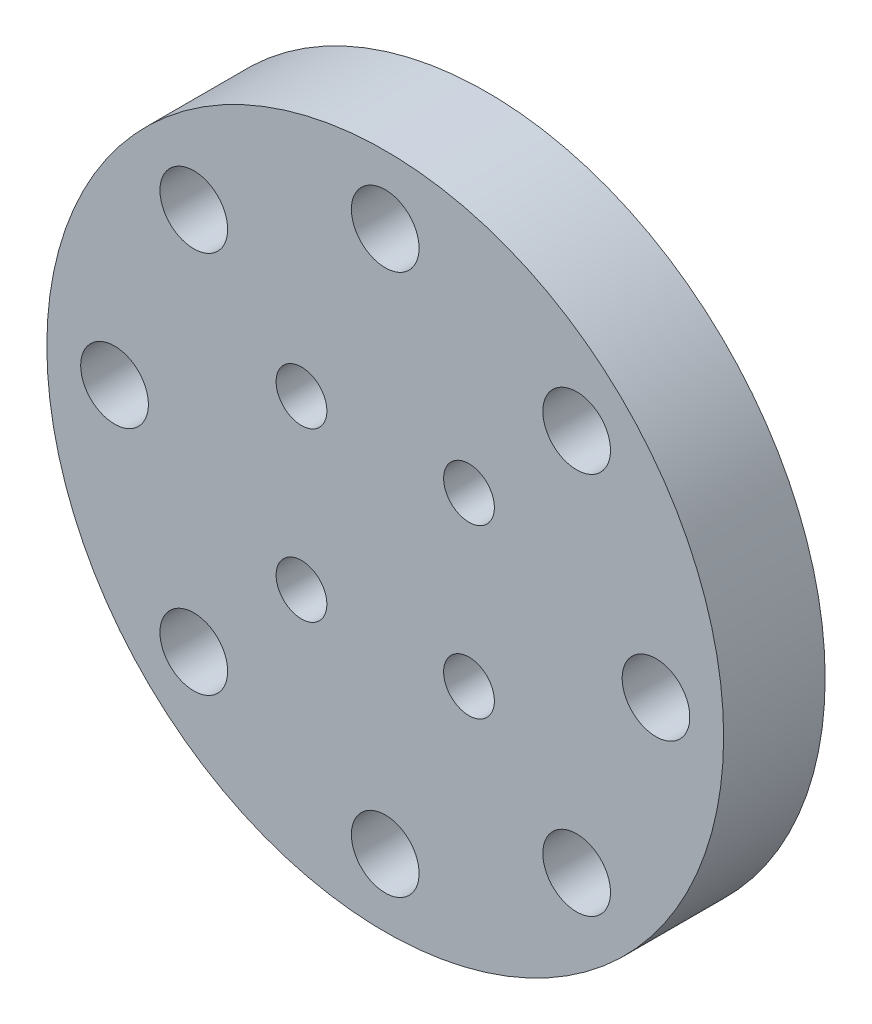
ISO-10303-21;
HEADER;
FILE_DESCRIPTION(('STEP AP214'),'2;1');
FILE_NAME('part.step','',(''),(''),'','','');
FILE_SCHEMA(('AUTOMOTIVE_DESIGN { 1 0 10303 214 1 1 1 1 }'));
ENDSEC;
DATA;
#1=APPLICATION_CONTEXT('core data for automotive mechanical design processes');
#2=APPLICATION_PROTOCOL_DEFINITION('international standard','automotive_design',2000,#1);
#3=PRODUCT_CONTEXT('',#1,'mechanical');
#4=PRODUCT('Part','Part','',(#3));
#5=PRODUCT_RELATED_PRODUCT_CATEGORY('part','',(#4));
#6=PRODUCT_DEFINITION_FORMATION('','',#4);
#7=PRODUCT_DEFINITION_CONTEXT('part definition',#1,'design');
#8=PRODUCT_DEFINITION('design','',#6,#7);
#9=PRODUCT_DEFINITION_SHAPE('','',#8);
#10=(LENGTH_UNIT() NAMED_UNIT(*) SI_UNIT(.MILLI.,.METRE.));
#11=(NAMED_UNIT(*) PLANE_ANGLE_UNIT() SI_UNIT($,.RADIAN.));
#12=(NAMED_UNIT(*) SI_UNIT($,.STERADIAN.) SOLID_ANGLE_UNIT());
#13=UNCERTAINTY_MEASURE_WITH_UNIT(LENGTH_MEASURE(1.E-05),#10,'distance_accuracy_value','');
#14=(GEOMETRIC_REPRESENTATION_CONTEXT(3) GLOBAL_UNCERTAINTY_ASSIGNED_CONTEXT((#13)) GLOBAL_UNIT_ASSIGNED_CONTEXT((#10,
#11,#12)) REPRESENTATION_CONTEXT('',''));
#15=CARTESIAN_POINT('',(0.,0.,0.));
#16=DIRECTION('',(0.,0.,1.));
#17=DIRECTION('',(1.,0.,0.));
#18=AXIS2_PLACEMENT_3D('',#15,#16,#17);
#19=CARTESIAN_POINT('',(4.94974746830581,-4.94974746830586,6.));
#20=DIRECTION('',(0.,0.,-1.));
#21=DIRECTION('',(-1.,0.,0.));
#22=AXIS2_PLACEMENT_3D('',#19,#20,#21);
#23=CYLINDRICAL_SURFACE('',#22,1.5);
#24=CARTESIAN_POINT('',(4.94974746830581,-4.94974746830586,6.));
#25=DIRECTION('',(0.,0.,-1.));
#26=DIRECTION('',(-1.,0.,0.));
#27=AXIS2_PLACEMENT_3D('',#24,#25,#26);
#28=CIRCLE('',#27,1.5);
#29=CARTESIAN_POINT('',(3.44974746830581,-4.94974746830586,6.));
#30=VERTEX_POINT('',#29);
#31=EDGE_CURVE('E114',#30,#30,#28,.T.);
#32=ORIENTED_EDGE('',*,*,#31,.F.);
#33=EDGE_LOOP('',(#32));
#34=FACE_BOUND('',#33,.T.);
#35=CARTESIAN_POINT('',(4.94974746830581,-4.94974746830586,3.1));
#36=DIRECTION('',(0.,0.,-1.));
#37=DIRECTION('',(-1.,0.,0.));
#38=AXIS2_PLACEMENT_3D('',#35,#36,#37);
#39=CIRCLE('',#38,1.5);
#40=CARTESIAN_POINT('',(3.44974746830581,-4.94974746830586,3.1));
#41=VERTEX_POINT('',#40);
#42=EDGE_CURVE('E39',#41,#41,#39,.F.);
#43=ORIENTED_EDGE('',*,*,#42,.F.);
#44=EDGE_LOOP('',(#43));
#45=FACE_BOUND('',#44,.T.);
#46=ADVANCED_FACE('F35',(#34,#45),#23,.F.);
#47=CARTESIAN_POINT('',(4.94974746830586,4.94974746830581,6.));
#48=DIRECTION('',(0.,0.,-1.));
#49=DIRECTION('',(-1.,0.,0.));
#50=AXIS2_PLACEMENT_3D('',#47,#48,#49);
#51=CYLINDRICAL_SURFACE('',#50,1.5);
#52=CARTESIAN_POINT('',(4.94974746830586,4.94974746830581,6.));
#53=DIRECTION('',(0.,0.,-1.));
#54=DIRECTION('',(-1.,0.,0.));
#55=AXIS2_PLACEMENT_3D('',#52,#53,#54);
#56=CIRCLE('',#55,1.5);
#57=CARTESIAN_POINT('',(3.44974746830586,4.94974746830581,6.));
#58=VERTEX_POINT('',#57);
#59=EDGE_CURVE('E74',#58,#58,#56,.T.);
#60=ORIENTED_EDGE('',*,*,#59,.F.);
#61=EDGE_LOOP('',(#60));
#62=FACE_BOUND('',#61,.T.);
#63=CARTESIAN_POINT('',(4.94974746830586,4.94974746830581,3.1));
#64=DIRECTION('',(0.,0.,-1.));
#65=DIRECTION('',(-1.,0.,0.));
#66=AXIS2_PLACEMENT_3D('',#63,#64,#65);
#67=CIRCLE('',#66,1.5);
#68=CARTESIAN_POINT('',(3.44974746830586,4.94974746830581,3.1));
#69=VERTEX_POINT('',#68);
#70=EDGE_CURVE('E60',#69,#69,#67,.F.);
#71=ORIENTED_EDGE('',*,*,#70,.F.);
#72=EDGE_LOOP('',(#71));
#73=FACE_BOUND('',#72,.T.);
#74=ADVANCED_FACE('F145',(#62,#73),#51,.F.);
#75=CARTESIAN_POINT('',(-4.94974746830581,4.94974746830586,6.));
#76=DIRECTION('',(0.,0.,-1.));
#77=DIRECTION('',(-1.,0.,0.));
#78=AXIS2_PLACEMENT_3D('',#75,#76,#77);
#79=CYLINDRICAL_SURFACE('',#78,1.5);
#80=CARTESIAN_POINT('',(-4.94974746830581,4.94974746830586,6.));
#81=DIRECTION('',(0.,0.,-1.));
#82=DIRECTION('',(-1.,0.,0.));
#83=AXIS2_PLACEMENT_3D('',#80,#81,#82);
#84=CIRCLE('',#83,1.5);
#85=CARTESIAN_POINT('',(-6.44974746830581,4.94974746830586,6.));
#86=VERTEX_POINT('',#85);
#87=EDGE_CURVE('E69',#86,#86,#84,.T.);
#88=ORIENTED_EDGE('',*,*,#87,.F.);
#89=EDGE_LOOP('',(#88));
#90=FACE_BOUND('',#89,.T.);
#91=CARTESIAN_POINT('',(-4.94974746830581,4.94974746830586,3.1));
#92=DIRECTION('',(0.,0.,-1.));
#93=DIRECTION('',(-1.,0.,0.));
#94=AXIS2_PLACEMENT_3D('',#91,#92,#93);
#95=CIRCLE('',#94,1.5);
#96=CARTESIAN_POINT('',(-6.44974746830581,4.94974746830586,3.1));
#97=VERTEX_POINT('',#96);
#98=EDGE_CURVE('E57',#97,#97,#95,.F.);
#99=ORIENTED_EDGE('',*,*,#98,.F.);
#100=EDGE_LOOP('',(#99));
#101=FACE_BOUND('',#100,.T.);
#102=ADVANCED_FACE('F150',(#90,#101),#79,.F.);
#103=CARTESIAN_POINT('',(-4.94974746830586,-4.94974746830581,6.));
#104=DIRECTION('',(0.,0.,-1.));
#105=DIRECTION('',(-1.,0.,0.));
#106=AXIS2_PLACEMENT_3D('',#103,#104,#105);
#107=CYLINDRICAL_SURFACE('',#106,1.5);
#108=CARTESIAN_POINT('',(-4.94974746830586,-4.94974746830581,6.));
#109=DIRECTION('',(0.,0.,-1.));
#110=DIRECTION('',(-1.,0.,0.));
#111=AXIS2_PLACEMENT_3D('',#108,#109,#110);
#112=CIRCLE('',#111,1.5);
#113=CARTESIAN_POINT('',(-6.44974746830586,-4.94974746830581,6.));
#114=VERTEX_POINT('',#113);
#115=EDGE_CURVE('E65',#114,#114,#112,.T.);
#116=ORIENTED_EDGE('',*,*,#115,.F.);
#117=EDGE_LOOP('',(#116));
#118=FACE_BOUND('',#117,.T.);
#119=CARTESIAN_POINT('',(-4.94974746830586,-4.94974746830581,3.1));
#120=DIRECTION('',(0.,0.,-1.));
#121=DIRECTION('',(-1.,0.,0.));
#122=AXIS2_PLACEMENT_3D('',#119,#120,#121);
#123=CIRCLE('',#122,1.5);
#124=CARTESIAN_POINT('',(-6.44974746830586,-4.94974746830581,3.1));
#125=VERTEX_POINT('',#124);
#126=EDGE_CURVE('E54',#125,#125,#123,.F.);
#127=ORIENTED_EDGE('',*,*,#126,.F.);
#128=EDGE_LOOP('',(#127));
#129=FACE_BOUND('',#128,.T.);
#130=ADVANCED_FACE('F172',(#118,#129),#107,.F.);
#131=CARTESIAN_POINT('',(0.,0.,6.));
#132=DIRECTION('',(0.,0.,-1.));
#133=DIRECTION('',(-1.,0.,0.));
#134=AXIS2_PLACEMENT_3D('',#131,#132,#133);
#135=CYLINDRICAL_SURFACE('',#134,20.);
#136=CARTESIAN_POINT('',(0.,0.,6.));
#137=DIRECTION('',(0.,0.,1.));
#138=DIRECTION('',(1.,0.,0.));
#139=AXIS2_PLACEMENT_3D('',#136,#137,#138);
#140=CIRCLE('',#139,20.);
#141=CARTESIAN_POINT('',(20.,0.,6.));
#142=VERTEX_POINT('',#141);
#143=EDGE_CURVE('E10',#142,#142,#140,.T.);
#144=ORIENTED_EDGE('',*,*,#143,.F.);
#145=EDGE_LOOP('',(#144));
#146=FACE_BOUND('',#145,.T.);
#147=CARTESIAN_POINT('',(0.,0.,0.));
#148=DIRECTION('',(0.,0.,1.));
#149=DIRECTION('',(1.,0.,0.));
#150=AXIS2_PLACEMENT_3D('',#147,#148,#149);
#151=CIRCLE('',#150,20.);
#152=CARTESIAN_POINT('',(20.,0.,0.));
#153=VERTEX_POINT('',#152);
#154=EDGE_CURVE('E43',#153,#153,#151,.T.);
#155=ORIENTED_EDGE('',*,*,#154,.T.);
#156=EDGE_LOOP('',(#155));
#157=FACE_BOUND('',#156,.T.);
#158=ADVANCED_FACE('F37',(#146,#157),#135,.T.);
#159=CARTESIAN_POINT('',(0.,0.,6.));
#160=DIRECTION('',(0.,0.,1.));
#161=DIRECTION('',(1.,0.,0.));
#162=AXIS2_PLACEMENT_3D('',#159,#160,#161);
#163=PLANE('',#162);
#164=CARTESIAN_POINT('',(0.,16.,6.));
#165=DIRECTION('',(0.,0.,-1.));
#166=DIRECTION('',(-1.,0.,0.));
#167=AXIS2_PLACEMENT_3D('',#164,#165,#166);
#168=CIRCLE('',#167,2.);
#169=CARTESIAN_POINT('',(-2.,16.,6.));
#170=VERTEX_POINT('',#169);
#171=EDGE_CURVE('E48',#170,#170,#168,.T.);
#172=ORIENTED_EDGE('',*,*,#171,.T.);
#173=EDGE_LOOP('',(#172));
#174=FACE_BOUND('',#173,.T.);
#175=ORIENTED_EDGE('',*,*,#115,.T.);
#176=EDGE_LOOP('',(#175));
#177=FACE_BOUND('',#176,.T.);
#178=ORIENTED_EDGE('',*,*,#87,.T.);
#179=EDGE_LOOP('',(#178));
#180=FACE_BOUND('',#179,.T.);
#181=ORIENTED_EDGE('',*,*,#59,.T.);
#182=EDGE_LOOP('',(#181));
#183=FACE_BOUND('',#182,.T.);
#184=CARTESIAN_POINT('',(-11.3137084989847,-11.3137084989848,6.));
#185=DIRECTION('',(0.,0.,-1.));
#186=DIRECTION('',(-1.,0.,0.));
#187=AXIS2_PLACEMENT_3D('',#184,#185,#186);
#188=CIRCLE('',#187,2.);
#189=CARTESIAN_POINT('',(-13.3137084989847,-11.3137084989848,6.));
#190=VERTEX_POINT('',#189);
#191=EDGE_CURVE('E81',#190,#190,#188,.T.);
#192=ORIENTED_EDGE('',*,*,#191,.T.);
#193=EDGE_LOOP('',(#192));
#194=FACE_BOUND('',#193,.T.);
#195=CARTESIAN_POINT('',(-16.,0.,6.));
#196=DIRECTION('',(0.,0.,-1.));
#197=DIRECTION('',(-1.,0.,0.));
#198=AXIS2_PLACEMENT_3D('',#195,#196,#197);
#199=CIRCLE('',#198,2.);
#200=CARTESIAN_POINT('',(-18.,0.,6.));
#201=VERTEX_POINT('',#200);
#202=EDGE_CURVE('E106',#201,#201,#199,.T.);
#203=ORIENTED_EDGE('',*,*,#202,.T.);
#204=EDGE_LOOP('',(#203));
#205=FACE_BOUND('',#204,.T.);
#206=CARTESIAN_POINT('',(-11.3137084989848,11.3137084989847,6.));
#207=DIRECTION('',(0.,0.,-1.));
#208=DIRECTION('',(-1.,0.,0.));
#209=AXIS2_PLACEMENT_3D('',#206,#207,#208);
#210=CIRCLE('',#209,2.);
#211=CARTESIAN_POINT('',(-13.3137084989848,11.3137084989847,6.));
#212=VERTEX_POINT('',#211);
#213=EDGE_CURVE('E51',#212,#212,#210,.T.);
#214=ORIENTED_EDGE('',*,*,#213,.T.);
#215=EDGE_LOOP('',(#214));
#216=FACE_BOUND('',#215,.T.);
#217=ORIENTED_EDGE('',*,*,#31,.T.);
#218=EDGE_LOOP('',(#217));
#219=FACE_BOUND('',#218,.T.);
#220=CARTESIAN_POINT('',(1.1172740284298E-13,-16.,6.));
#221=DIRECTION('',(0.,0.,-1.));
#222=DIRECTION('',(-1.,0.,0.));
#223=AXIS2_PLACEMENT_3D('',#220,#221,#222);
#224=CIRCLE('',#223,2.);
#225=CARTESIAN_POINT('',(-1.99999999999989,-16.,6.));
#226=VERTEX_POINT('',#225);
#227=EDGE_CURVE('E82',#226,#226,#224,.T.);
#228=ORIENTED_EDGE('',*,*,#227,.T.);
#229=EDGE_LOOP('',(#228));
#230=FACE_BOUND('',#229,.T.);
#231=CARTESIAN_POINT('',(11.3137084989849,-11.3137084989847,6.));
#232=DIRECTION('',(0.,0.,-1.));
#233=DIRECTION('',(-1.,0.,0.));
#234=AXIS2_PLACEMENT_3D('',#231,#232,#233);
#235=CIRCLE('',#234,2.);
#236=CARTESIAN_POINT('',(9.31370849898486,-11.3137084989847,6.));
#237=VERTEX_POINT('',#236);
#238=EDGE_CURVE('E88',#237,#237,#235,.T.);
#239=ORIENTED_EDGE('',*,*,#238,.T.);
#240=EDGE_LOOP('',(#239));
#241=FACE_BOUND('',#240,.T.);
#242=CARTESIAN_POINT('',(16.,1.6759110426447E-13,6.));
#243=DIRECTION('',(0.,0.,-1.));
#244=DIRECTION('',(-1.,0.,0.));
#245=AXIS2_PLACEMENT_3D('',#242,#243,#244);
#246=CIRCLE('',#245,2.);
#247=CARTESIAN_POINT('',(14.,1.6759110426447E-13,6.));
#248=VERTEX_POINT('',#247);
#249=EDGE_CURVE('E94',#248,#248,#246,.T.);
#250=ORIENTED_EDGE('',*,*,#249,.T.);
#251=EDGE_LOOP('',(#250));
#252=FACE_BOUND('',#251,.T.);
#253=CARTESIAN_POINT('',(11.3137084989846,11.3137084989849,6.));
#254=DIRECTION('',(0.,0.,-1.));
#255=DIRECTION('',(-1.,0.,0.));
#256=AXIS2_PLACEMENT_3D('',#253,#254,#255);
#257=CIRCLE('',#256,2.);
#258=CARTESIAN_POINT('',(9.31370849898462,11.3137084989849,6.));
#259=VERTEX_POINT('',#258);
#260=EDGE_CURVE('E100',#259,#259,#257,.T.);
#261=ORIENTED_EDGE('',*,*,#260,.T.);
#262=EDGE_LOOP('',(#261));
#263=FACE_BOUND('',#262,.T.);
#264=ORIENTED_EDGE('',*,*,#143,.T.);
#265=EDGE_LOOP('',(#264));
#266=FACE_BOUND('',#265,.T.);
#267=ADVANCED_FACE('F124',(#174,#177,#180,#183,#194,#205,#216,#219,#230,#241,#252,#263,#266),
#163,.T.);
#268=CARTESIAN_POINT('',(0.,0.,0.));
#269=DIRECTION('',(0.,0.,1.));
#270=DIRECTION('',(1.,0.,0.));
#271=AXIS2_PLACEMENT_3D('',#268,#269,#270);
#272=PLANE('',#271);
#273=CARTESIAN_POINT('',(4.94974746830586,-4.94974746830581,0.));
#274=DIRECTION('',(0.,0.,-1.));
#275=DIRECTION('',(-1.,0.,0.));
#276=AXIS2_PLACEMENT_3D('',#273,#274,#275);
#277=CIRCLE('',#276,3.);
#278=CARTESIAN_POINT('',(1.94974746830586,-4.94974746830581,0.));
#279=VERTEX_POINT('',#278);
#280=EDGE_CURVE('E235',#279,#279,#277,.T.);
#281=ORIENTED_EDGE('',*,*,#280,.F.);
#282=EDGE_LOOP('',(#281));
#283=FACE_BOUND('',#282,.T.);
#284=CARTESIAN_POINT('',(-4.94974746830582,-4.94974746830584,0.));
#285=DIRECTION('',(0.,0.,-1.));
#286=DIRECTION('',(-1.,0.,0.));
#287=AXIS2_PLACEMENT_3D('',#284,#285,#286);
#288=CIRCLE('',#287,3.);
#289=CARTESIAN_POINT('',(-7.94974746830582,-4.94974746830584,0.));
#290=VERTEX_POINT('',#289);
#291=EDGE_CURVE('E227',#290,#290,#288,.T.);
#292=ORIENTED_EDGE('',*,*,#291,.F.);
#293=EDGE_LOOP('',(#292));
#294=FACE_BOUND('',#293,.T.);
#295=CARTESIAN_POINT('',(-4.94974746830582,4.94974746830584,0.));
#296=DIRECTION('',(0.,0.,-1.));
#297=DIRECTION('',(-1.,0.,0.));
#298=AXIS2_PLACEMENT_3D('',#295,#296,#297);
#299=CIRCLE('',#298,3.);
#300=CARTESIAN_POINT('',(-7.94974746830582,4.94974746830584,0.));
#301=VERTEX_POINT('',#300);
#302=EDGE_CURVE('E221',#301,#301,#299,.T.);
#303=ORIENTED_EDGE('',*,*,#302,.F.);
#304=EDGE_LOOP('',(#303));
#305=FACE_BOUND('',#304,.T.);
#306=CARTESIAN_POINT('',(4.94974746830586,4.94974746830581,0.));
#307=DIRECTION('',(0.,0.,-1.));
#308=DIRECTION('',(-1.,0.,0.));
#309=AXIS2_PLACEMENT_3D('',#306,#307,#308);
#310=CIRCLE('',#309,3.);
#311=CARTESIAN_POINT('',(1.94974746830586,4.94974746830581,0.));
#312=VERTEX_POINT('',#311);
#313=EDGE_CURVE('E223',#312,#312,#310,.T.);
#314=ORIENTED_EDGE('',*,*,#313,.F.);
#315=EDGE_LOOP('',(#314));
#316=FACE_BOUND('',#315,.T.);
#317=CARTESIAN_POINT('',(0.,16.,0.));
#318=DIRECTION('',(0.,0.,-1.));
#319=DIRECTION('',(-1.,0.,0.));
#320=AXIS2_PLACEMENT_3D('',#317,#318,#319);
#321=CIRCLE('',#320,2.);
#322=CARTESIAN_POINT('',(-2.,16.,0.));
#323=VERTEX_POINT('',#322);
#324=EDGE_CURVE('E116',#323,#323,#321,.T.);
#325=ORIENTED_EDGE('',*,*,#324,.F.);
#326=EDGE_LOOP('',(#325));
#327=FACE_BOUND('',#326,.T.);
#328=CARTESIAN_POINT('',(-11.3137084989847,-11.3137084989848,0.));
#329=DIRECTION('',(0.,0.,-1.));
#330=DIRECTION('',(-1.,0.,0.));
#331=AXIS2_PLACEMENT_3D('',#328,#329,#330);
#332=CIRCLE('',#331,2.);
#333=CARTESIAN_POINT('',(-13.3137084989847,-11.3137084989848,0.));
#334=VERTEX_POINT('',#333);
#335=EDGE_CURVE('E109',#334,#334,#332,.T.);
#336=ORIENTED_EDGE('',*,*,#335,.F.);
#337=EDGE_LOOP('',(#336));
#338=FACE_BOUND('',#337,.T.);
#339=CARTESIAN_POINT('',(-16.,0.,0.));
#340=DIRECTION('',(0.,0.,-1.));
#341=DIRECTION('',(-1.,0.,0.));
#342=AXIS2_PLACEMENT_3D('',#339,#340,#341);
#343=CIRCLE('',#342,2.);
#344=CARTESIAN_POINT('',(-18.,0.,0.));
#345=VERTEX_POINT('',#344);
#346=EDGE_CURVE('E103',#345,#345,#343,.T.);
#347=ORIENTED_EDGE('',*,*,#346,.F.);
#348=EDGE_LOOP('',(#347));
#349=FACE_BOUND('',#348,.T.);
#350=CARTESIAN_POINT('',(-11.3137084989848,11.3137084989847,0.));
#351=DIRECTION('',(0.,0.,-1.));
#352=DIRECTION('',(-1.,0.,0.));
#353=AXIS2_PLACEMENT_3D('',#350,#351,#352);
#354=CIRCLE('',#353,2.);
#355=CARTESIAN_POINT('',(-13.3137084989848,11.3137084989847,0.));
#356=VERTEX_POINT('',#355);
#357=EDGE_CURVE('E117',#356,#356,#354,.T.);
#358=ORIENTED_EDGE('',*,*,#357,.F.);
#359=EDGE_LOOP('',(#358));
#360=FACE_BOUND('',#359,.T.);
#361=CARTESIAN_POINT('',(1.1172740284298E-13,-16.,0.));
#362=DIRECTION('',(0.,0.,-1.));
#363=DIRECTION('',(-1.,0.,0.));
#364=AXIS2_PLACEMENT_3D('',#361,#362,#363);
#365=CIRCLE('',#364,2.);
#366=CARTESIAN_POINT('',(-1.99999999999989,-16.,0.));
#367=VERTEX_POINT('',#366);
#368=EDGE_CURVE('E78',#367,#367,#365,.T.);
#369=ORIENTED_EDGE('',*,*,#368,.F.);
#370=EDGE_LOOP('',(#369));
#371=FACE_BOUND('',#370,.T.);
#372=CARTESIAN_POINT('',(11.3137084989849,-11.3137084989847,0.));
#373=DIRECTION('',(0.,0.,-1.));
#374=DIRECTION('',(-1.,0.,0.));
#375=AXIS2_PLACEMENT_3D('',#372,#373,#374);
#376=CIRCLE('',#375,2.);
#377=CARTESIAN_POINT('',(9.31370849898486,-11.3137084989847,0.));
#378=VERTEX_POINT('',#377);
#379=EDGE_CURVE('E85',#378,#378,#376,.T.);
#380=ORIENTED_EDGE('',*,*,#379,.F.);
#381=EDGE_LOOP('',(#380));
#382=FACE_BOUND('',#381,.T.);
#383=CARTESIAN_POINT('',(16.,1.6759110426447E-13,0.));
#384=DIRECTION('',(0.,0.,-1.));
#385=DIRECTION('',(-1.,0.,0.));
#386=AXIS2_PLACEMENT_3D('',#383,#384,#385);
#387=CIRCLE('',#386,2.);
#388=CARTESIAN_POINT('',(14.,1.6759110426447E-13,0.));
#389=VERTEX_POINT('',#388);
#390=EDGE_CURVE('E91',#389,#389,#387,.T.);
#391=ORIENTED_EDGE('',*,*,#390,.F.);
#392=EDGE_LOOP('',(#391));
#393=FACE_BOUND('',#392,.T.);
#394=CARTESIAN_POINT('',(11.3137084989846,11.3137084989849,0.));
#395=DIRECTION('',(0.,0.,-1.));
#396=DIRECTION('',(-1.,0.,0.));
#397=AXIS2_PLACEMENT_3D('',#394,#395,#396);
#398=CIRCLE('',#397,2.);
#399=CARTESIAN_POINT('',(9.31370849898462,11.3137084989849,0.));
#400=VERTEX_POINT('',#399);
#401=EDGE_CURVE('E97',#400,#400,#398,.T.);
#402=ORIENTED_EDGE('',*,*,#401,.F.);
#403=EDGE_LOOP('',(#402));
#404=FACE_BOUND('',#403,.T.);
#405=ORIENTED_EDGE('',*,*,#154,.F.);
#406=EDGE_LOOP('',(#405));
#407=FACE_BOUND('',#406,.T.);
#408=ADVANCED_FACE('F164',(#283,#294,#305,#316,#327,#338,#349,#360,#371,#382,#393,#404,#407),
#272,.F.);
#409=CARTESIAN_POINT('',(11.3137084989846,11.3137084989849,6.));
#410=DIRECTION('',(0.,0.,-1.));
#411=DIRECTION('',(-1.,0.,0.));
#412=AXIS2_PLACEMENT_3D('',#409,#410,#411);
#413=CYLINDRICAL_SURFACE('',#412,2.);
#414=ORIENTED_EDGE('',*,*,#260,.F.);
#415=EDGE_LOOP('',(#414));
#416=FACE_BOUND('',#415,.T.);
#417=ORIENTED_EDGE('',*,*,#401,.T.);
#418=EDGE_LOOP('',(#417));
#419=FACE_BOUND('',#418,.T.);
#420=ADVANCED_FACE('F160',(#416,#419),#413,.F.);
#421=CARTESIAN_POINT('',(16.,1.6759110426447E-13,6.));
#422=DIRECTION('',(0.,0.,-1.));
#423=DIRECTION('',(-1.,0.,0.));
#424=AXIS2_PLACEMENT_3D('',#421,#422,#423);
#425=CYLINDRICAL_SURFACE('',#424,2.);
#426=ORIENTED_EDGE('',*,*,#249,.F.);
#427=EDGE_LOOP('',(#426));
#428=FACE_BOUND('',#427,.T.);
#429=ORIENTED_EDGE('',*,*,#390,.T.);
#430=EDGE_LOOP('',(#429));
#431=FACE_BOUND('',#430,.T.);
#432=ADVANCED_FACE('F163',(#428,#431),#425,.F.);
#433=CARTESIAN_POINT('',(11.3137084989849,-11.3137084989847,6.));
#434=DIRECTION('',(0.,0.,-1.));
#435=DIRECTION('',(-1.,0.,0.));
#436=AXIS2_PLACEMENT_3D('',#433,#434,#435);
#437=CYLINDRICAL_SURFACE('',#436,2.);
#438=ORIENTED_EDGE('',*,*,#238,.F.);
#439=EDGE_LOOP('',(#438));
#440=FACE_BOUND('',#439,.T.);
#441=ORIENTED_EDGE('',*,*,#379,.T.);
#442=EDGE_LOOP('',(#441));
#443=FACE_BOUND('',#442,.T.);
#444=ADVANCED_FACE('F139',(#440,#443),#437,.F.);
#445=CARTESIAN_POINT('',(1.1172740284298E-13,-16.,6.));
#446=DIRECTION('',(0.,0.,-1.));
#447=DIRECTION('',(-1.,0.,0.));
#448=AXIS2_PLACEMENT_3D('',#445,#446,#447);
#449=CYLINDRICAL_SURFACE('',#448,2.);
#450=ORIENTED_EDGE('',*,*,#227,.F.);
#451=EDGE_LOOP('',(#450));
#452=FACE_BOUND('',#451,.T.);
#453=ORIENTED_EDGE('',*,*,#368,.T.);
#454=EDGE_LOOP('',(#453));
#455=FACE_BOUND('',#454,.T.);
#456=ADVANCED_FACE('F130',(#452,#455),#449,.F.);
#457=CARTESIAN_POINT('',(-11.3137084989848,11.3137084989847,6.));
#458=DIRECTION('',(0.,0.,-1.));
#459=DIRECTION('',(-1.,0.,0.));
#460=AXIS2_PLACEMENT_3D('',#457,#458,#459);
#461=CYLINDRICAL_SURFACE('',#460,2.);
#462=ORIENTED_EDGE('',*,*,#213,.F.);
#463=EDGE_LOOP('',(#462));
#464=FACE_BOUND('',#463,.T.);
#465=ORIENTED_EDGE('',*,*,#357,.T.);
#466=EDGE_LOOP('',(#465));
#467=FACE_BOUND('',#466,.T.);
#468=ADVANCED_FACE('F127',(#464,#467),#461,.F.);
#469=CARTESIAN_POINT('',(-16.,0.,6.));
#470=DIRECTION('',(0.,0.,-1.));
#471=DIRECTION('',(-1.,0.,0.));
#472=AXIS2_PLACEMENT_3D('',#469,#470,#471);
#473=CYLINDRICAL_SURFACE('',#472,2.);
#474=ORIENTED_EDGE('',*,*,#202,.F.);
#475=EDGE_LOOP('',(#474));
#476=FACE_BOUND('',#475,.T.);
#477=ORIENTED_EDGE('',*,*,#346,.T.);
#478=EDGE_LOOP('',(#477));
#479=FACE_BOUND('',#478,.T.);
#480=ADVANCED_FACE('F129',(#476,#479),#473,.F.);
#481=CARTESIAN_POINT('',(-11.3137084989847,-11.3137084989848,6.));
#482=DIRECTION('',(0.,0.,-1.));
#483=DIRECTION('',(-1.,0.,0.));
#484=AXIS2_PLACEMENT_3D('',#481,#482,#483);
#485=CYLINDRICAL_SURFACE('',#484,2.);
#486=ORIENTED_EDGE('',*,*,#191,.F.);
#487=EDGE_LOOP('',(#486));
#488=FACE_BOUND('',#487,.T.);
#489=ORIENTED_EDGE('',*,*,#335,.T.);
#490=EDGE_LOOP('',(#489));
#491=FACE_BOUND('',#490,.T.);
#492=ADVANCED_FACE('F136',(#488,#491),#485,.F.);
#493=CARTESIAN_POINT('',(0.,16.,6.));
#494=DIRECTION('',(0.,0.,-1.));
#495=DIRECTION('',(-1.,0.,0.));
#496=AXIS2_PLACEMENT_3D('',#493,#494,#495);
#497=CYLINDRICAL_SURFACE('',#496,2.);
#498=ORIENTED_EDGE('',*,*,#171,.F.);
#499=EDGE_LOOP('',(#498));
#500=FACE_BOUND('',#499,.T.);
#501=ORIENTED_EDGE('',*,*,#324,.T.);
#502=EDGE_LOOP('',(#501));
#503=FACE_BOUND('',#502,.T.);
#504=ADVANCED_FACE('F157',(#500,#503),#497,.F.);
#505=CARTESIAN_POINT('',(-4.94974746830582,-4.94974746830584,3.1));
#506=DIRECTION('',(0.,0.,-1.));
#507=DIRECTION('',(-1.,0.,0.));
#508=AXIS2_PLACEMENT_3D('',#505,#506,#507);
#509=PLANE('',#508);
#510=CARTESIAN_POINT('',(-4.94974746830582,-4.94974746830584,3.1));
#511=DIRECTION('',(0.,0.,-1.));
#512=DIRECTION('',(-1.,0.,0.));
#513=AXIS2_PLACEMENT_3D('',#510,#511,#512);
#514=CIRCLE('',#513,3.);
#515=CARTESIAN_POINT('',(-7.94974746830582,-4.94974746830584,3.1));
#516=VERTEX_POINT('',#515);
#517=EDGE_CURVE('E232',#516,#516,#514,.T.);
#518=ORIENTED_EDGE('',*,*,#517,.T.);
#519=EDGE_LOOP('',(#518));
#520=FACE_BOUND('',#519,.T.);
#521=ORIENTED_EDGE('',*,*,#126,.T.);
#522=EDGE_LOOP('',(#521));
#523=FACE_BOUND('',#522,.T.);
#524=ADVANCED_FACE('F181',(#520,#523),#509,.T.);
#525=CARTESIAN_POINT('',(-4.94974746830582,-4.94974746830584,3.1));
#526=DIRECTION('',(0.,0.,-1.));
#527=DIRECTION('',(-1.,0.,0.));
#528=AXIS2_PLACEMENT_3D('',#525,#526,#527);
#529=CYLINDRICAL_SURFACE('',#528,3.);
#530=CARTESIAN_POINT('',(-7.94974746830582,-4.94974746830584,3.1));
#531=CARTESIAN_POINT('',(-7.94974746830582,-4.94974746830584,3.06770833333333));
#532=CARTESIAN_POINT('',(-7.94974746830582,-4.94974746830584,3.03541666666667));
#533=CARTESIAN_POINT('',(-7.94974746830582,-4.94974746830584,2.97083333333333));
#534=CARTESIAN_POINT('',(-7.94974746830582,-4.94974746830584,2.93854166666667));
#535=CARTESIAN_POINT('',(-7.94974746830582,-4.94974746830584,2.87395833333333));
#536=CARTESIAN_POINT('',(-7.94974746830582,-4.94974746830584,2.84166666666667));
#537=CARTESIAN_POINT('',(-7.94974746830582,-4.94974746830584,2.77708333333333));
#538=CARTESIAN_POINT('',(-7.94974746830582,-4.94974746830584,2.74479166666667));
#539=CARTESIAN_POINT('',(-7.94974746830582,-4.94974746830584,2.68020833333333));
#540=CARTESIAN_POINT('',(-7.94974746830582,-4.94974746830584,2.64791666666667));
#541=CARTESIAN_POINT('',(-7.94974746830582,-4.94974746830584,2.58333333333333));
#542=CARTESIAN_POINT('',(-7.94974746830582,-4.94974746830584,2.55104166666667));
#543=CARTESIAN_POINT('',(-7.94974746830582,-4.94974746830584,2.48645833333333));
#544=CARTESIAN_POINT('',(-7.94974746830582,-4.94974746830584,2.45416666666667));
#545=CARTESIAN_POINT('',(-7.94974746830582,-4.94974746830584,2.38958333333333));
#546=CARTESIAN_POINT('',(-7.94974746830582,-4.94974746830584,2.35729166666667));
#547=CARTESIAN_POINT('',(-7.94974746830582,-4.94974746830584,2.29270833333333));
#548=CARTESIAN_POINT('',(-7.94974746830582,-4.94974746830584,2.26041666666667));
#549=CARTESIAN_POINT('',(-7.94974746830582,-4.94974746830584,2.19583333333333));
#550=CARTESIAN_POINT('',(-7.94974746830582,-4.94974746830584,2.16354166666667));
#551=CARTESIAN_POINT('',(-7.94974746830582,-4.94974746830584,2.09895833333333));
#552=CARTESIAN_POINT('',(-7.94974746830582,-4.94974746830584,2.06666666666667));
#553=CARTESIAN_POINT('',(-7.94974746830582,-4.94974746830584,2.00208333333333));
#554=CARTESIAN_POINT('',(-7.94974746830582,-4.94974746830584,1.96979166666667));
#555=CARTESIAN_POINT('',(-7.94974746830582,-4.94974746830584,1.90520833333333));
#556=CARTESIAN_POINT('',(-7.94974746830582,-4.94974746830584,1.87291666666667));
#557=CARTESIAN_POINT('',(-7.94974746830582,-4.94974746830584,1.80833333333333));
#558=CARTESIAN_POINT('',(-7.94974746830582,-4.94974746830584,1.77604166666667));
#559=CARTESIAN_POINT('',(-7.94974746830582,-4.94974746830584,1.71145833333333));
#560=CARTESIAN_POINT('',(-7.94974746830582,-4.94974746830584,1.67916666666667));
#561=CARTESIAN_POINT('',(-7.94974746830582,-4.94974746830584,1.61458333333333));
#562=CARTESIAN_POINT('',(-7.94974746830582,-4.94974746830584,1.58229166666667));
#563=CARTESIAN_POINT('',(-7.94974746830582,-4.94974746830584,1.51770833333333));
#564=CARTESIAN_POINT('',(-7.94974746830582,-4.94974746830584,1.48541666666667));
#565=CARTESIAN_POINT('',(-7.94974746830582,-4.94974746830584,1.42083333333333));
#566=CARTESIAN_POINT('',(-7.94974746830582,-4.94974746830584,1.38854166666667));
#567=CARTESIAN_POINT('',(-7.94974746830582,-4.94974746830584,1.32395833333333));
#568=CARTESIAN_POINT('',(-7.94974746830582,-4.94974746830584,1.29166666666667));
#569=CARTESIAN_POINT('',(-7.94974746830582,-4.94974746830584,1.22708333333333));
#570=CARTESIAN_POINT('',(-7.94974746830582,-4.94974746830584,1.19479166666667));
#571=CARTESIAN_POINT('',(-7.94974746830582,-4.94974746830584,1.13020833333333));
#572=CARTESIAN_POINT('',(-7.94974746830582,-4.94974746830584,1.09791666666667));
#573=CARTESIAN_POINT('',(-7.94974746830582,-4.94974746830584,1.03333333333333));
#574=CARTESIAN_POINT('',(-7.94974746830582,-4.94974746830584,1.00104166666667));
#575=CARTESIAN_POINT('',(-7.94974746830582,-4.94974746830584,0.936458333333334));
#576=CARTESIAN_POINT('',(-7.94974746830582,-4.94974746830584,0.904166666666667));
#577=CARTESIAN_POINT('',(-7.94974746830582,-4.94974746830584,0.839583333333334));
#578=CARTESIAN_POINT('',(-7.94974746830582,-4.94974746830584,0.807291666666667));
#579=CARTESIAN_POINT('',(-7.94974746830582,-4.94974746830584,0.742708333333334));
#580=CARTESIAN_POINT('',(-7.94974746830582,-4.94974746830584,0.710416666666667));
#581=CARTESIAN_POINT('',(-7.94974746830582,-4.94974746830584,0.645833333333334));
#582=CARTESIAN_POINT('',(-7.94974746830582,-4.94974746830584,0.613541666666667));
#583=CARTESIAN_POINT('',(-7.94974746830582,-4.94974746830584,0.548958333333333));
#584=CARTESIAN_POINT('',(-7.94974746830582,-4.94974746830584,0.516666666666667));
#585=CARTESIAN_POINT('',(-7.94974746830582,-4.94974746830584,0.452083333333333));
#586=CARTESIAN_POINT('',(-7.94974746830582,-4.94974746830584,0.419791666666667));
#587=CARTESIAN_POINT('',(-7.94974746830582,-4.94974746830584,0.355208333333334));
#588=CARTESIAN_POINT('',(-7.94974746830582,-4.94974746830584,0.322916666666667));
#589=CARTESIAN_POINT('',(-7.94974746830582,-4.94974746830584,0.258333333333333));
#590=CARTESIAN_POINT('',(-7.94974746830582,-4.94974746830584,0.226041666666667));
#591=CARTESIAN_POINT('',(-7.94974746830582,-4.94974746830584,0.161458333333333));
#592=CARTESIAN_POINT('',(-7.94974746830582,-4.94974746830584,0.129166666666667));
#593=CARTESIAN_POINT('',(-7.94974746830582,-4.94974746830584,0.0645833333333335));
#594=CARTESIAN_POINT('',(-7.94974746830582,-4.94974746830584,0.0322916666666667));
#595=CARTESIAN_POINT('',(-7.94974746830582,-4.94974746830584,0.));
#596=B_SPLINE_CURVE_WITH_KNOTS('',3,(#530,#531,#532,#533,#534,#535,#536,#537,#538,#539,#540,
#541,#542,#543,#544,#545,#546,#547,#548,#549,#550,#551,#552,#553,#554,#555,#556,#557,#558,#559,
#560,#561,#562,#563,#564,#565,#566,#567,#568,#569,#570,#571,#572,#573,#574,#575,#576,#577,#578,
#579,#580,#581,#582,#583,#584,#585,#586,#587,#588,#589,#590,#591,#592,#593,#594,#595),
.UNSPECIFIED.,.F.,.F.,(4,2,2,2,2,2,2,2,2,2,2,2,2,2,2,2,2,2,2,2,2,2,2,2,2,2,2,2,2,2,2,2,4),(0.,
0.0968750000000002,0.19375,0.290625,0.3875,0.484375,0.58125,0.678125,0.775,0.871875,0.96875,
1.065625,1.1625,1.259375,1.35625,1.453125,1.55,1.646875,1.74375,1.840625,1.9375,2.034375,
2.13125,2.228125,2.325,2.421875,2.51875,2.615625,2.7125,2.809375,2.90625,3.003125,3.1),.UNSPECIFIED.);
#597=EDGE_CURVE('BSEAM202',#516,#290,#596,.T.);
#598=ORIENTED_EDGE('',*,*,#517,.F.);
#599=ORIENTED_EDGE('',*,*,#291,.T.);
#600=ORIENTED_EDGE('',*,*,#597,.T.);
#601=ORIENTED_EDGE('',*,*,#597,.F.);
#602=EDGE_LOOP('',(#598,#600,#599,#601));
#603=FACE_BOUND('',#602,.T.);
#604=ADVANCED_FACE('F202',(#603),#529,.F.);
#605=CARTESIAN_POINT('',(-4.94974746830582,4.94974746830584,3.1));
#606=DIRECTION('',(0.,0.,-1.));
#607=DIRECTION('',(-1.,0.,0.));
#608=AXIS2_PLACEMENT_3D('',#605,#606,#607);
#609=PLANE('',#608);
#610=CARTESIAN_POINT('',(-4.94974746830582,4.94974746830584,3.1));
#611=DIRECTION('',(0.,0.,-1.));
#612=DIRECTION('',(-1.,0.,0.));
#613=AXIS2_PLACEMENT_3D('',#610,#611,#612);
#614=CIRCLE('',#613,3.);
#615=CARTESIAN_POINT('',(-7.94974746830582,4.94974746830584,3.1));
#616=VERTEX_POINT('',#615);
#617=EDGE_CURVE('E218',#616,#616,#614,.T.);
#618=ORIENTED_EDGE('',*,*,#617,.T.);
#619=EDGE_LOOP('',(#618));
#620=FACE_BOUND('',#619,.T.);
#621=ORIENTED_EDGE('',*,*,#98,.T.);
#622=EDGE_LOOP('',(#621));
#623=FACE_BOUND('',#622,.T.);
#624=ADVANCED_FACE('F206',(#620,#623),#609,.T.);
#625=CARTESIAN_POINT('',(-4.94974746830582,4.94974746830584,3.1));
#626=DIRECTION('',(0.,0.,-1.));
#627=DIRECTION('',(-1.,0.,0.));
#628=AXIS2_PLACEMENT_3D('',#625,#626,#627);
#629=CYLINDRICAL_SURFACE('',#628,3.);
#630=CARTESIAN_POINT('',(-7.94974746830582,4.94974746830584,3.1));
#631=CARTESIAN_POINT('',(-7.94974746830582,4.94974746830584,3.06770833333333));
#632=CARTESIAN_POINT('',(-7.94974746830582,4.94974746830584,3.03541666666667));
#633=CARTESIAN_POINT('',(-7.94974746830582,4.94974746830584,2.97083333333333));
#634=CARTESIAN_POINT('',(-7.94974746830582,4.94974746830584,2.93854166666667));
#635=CARTESIAN_POINT('',(-7.94974746830582,4.94974746830584,2.87395833333333));
#636=CARTESIAN_POINT('',(-7.94974746830582,4.94974746830584,2.84166666666667));
#637=CARTESIAN_POINT('',(-7.94974746830582,4.94974746830584,2.77708333333333));
#638=CARTESIAN_POINT('',(-7.94974746830582,4.94974746830584,2.74479166666667));
#639=CARTESIAN_POINT('',(-7.94974746830582,4.94974746830584,2.68020833333333));
#640=CARTESIAN_POINT('',(-7.94974746830582,4.94974746830584,2.64791666666667));
#641=CARTESIAN_POINT('',(-7.94974746830582,4.94974746830584,2.58333333333333));
#642=CARTESIAN_POINT('',(-7.94974746830582,4.94974746830584,2.55104166666667));
#643=CARTESIAN_POINT('',(-7.94974746830582,4.94974746830584,2.48645833333333));
#644=CARTESIAN_POINT('',(-7.94974746830582,4.94974746830584,2.45416666666667));
#645=CARTESIAN_POINT('',(-7.94974746830582,4.94974746830584,2.38958333333333));
#646=CARTESIAN_POINT('',(-7.94974746830582,4.94974746830584,2.35729166666667));
#647=CARTESIAN_POINT('',(-7.94974746830582,4.94974746830584,2.29270833333333));
#648=CARTESIAN_POINT('',(-7.94974746830582,4.94974746830584,2.26041666666667));
#649=CARTESIAN_POINT('',(-7.94974746830582,4.94974746830584,2.19583333333333));
#650=CARTESIAN_POINT('',(-7.94974746830582,4.94974746830584,2.16354166666667));
#651=CARTESIAN_POINT('',(-7.94974746830582,4.94974746830584,2.09895833333333));
#652=CARTESIAN_POINT('',(-7.94974746830582,4.94974746830584,2.06666666666667));
#653=CARTESIAN_POINT('',(-7.94974746830582,4.94974746830584,2.00208333333333));
#654=CARTESIAN_POINT('',(-7.94974746830582,4.94974746830584,1.96979166666667));
#655=CARTESIAN_POINT('',(-7.94974746830582,4.94974746830584,1.90520833333333));
#656=CARTESIAN_POINT('',(-7.94974746830582,4.94974746830584,1.87291666666667));
#657=CARTESIAN_POINT('',(-7.94974746830582,4.94974746830584,1.80833333333333));
#658=CARTESIAN_POINT('',(-7.94974746830582,4.94974746830584,1.77604166666667));
#659=CARTESIAN_POINT('',(-7.94974746830582,4.94974746830584,1.71145833333333));
#660=CARTESIAN_POINT('',(-7.94974746830582,4.94974746830584,1.67916666666667));
#661=CARTESIAN_POINT('',(-7.94974746830582,4.94974746830584,1.61458333333333));
#662=CARTESIAN_POINT('',(-7.94974746830582,4.94974746830584,1.58229166666667));
#663=CARTESIAN_POINT('',(-7.94974746830582,4.94974746830584,1.51770833333333));
#664=CARTESIAN_POINT('',(-7.94974746830582,4.94974746830584,1.48541666666667));
#665=CARTESIAN_POINT('',(-7.94974746830582,4.94974746830584,1.42083333333333));
#666=CARTESIAN_POINT('',(-7.94974746830582,4.94974746830584,1.38854166666667));
#667=CARTESIAN_POINT('',(-7.94974746830582,4.94974746830584,1.32395833333333));
#668=CARTESIAN_POINT('',(-7.94974746830582,4.94974746830584,1.29166666666667));
#669=CARTESIAN_POINT('',(-7.94974746830582,4.94974746830584,1.22708333333333));
#670=CARTESIAN_POINT('',(-7.94974746830582,4.94974746830584,1.19479166666667));
#671=CARTESIAN_POINT('',(-7.94974746830582,4.94974746830584,1.13020833333333));
#672=CARTESIAN_POINT('',(-7.94974746830582,4.94974746830584,1.09791666666667));
#673=CARTESIAN_POINT('',(-7.94974746830582,4.94974746830584,1.03333333333333));
#674=CARTESIAN_POINT('',(-7.94974746830582,4.94974746830584,1.00104166666667));
#675=CARTESIAN_POINT('',(-7.94974746830582,4.94974746830584,0.936458333333334));
#676=CARTESIAN_POINT('',(-7.94974746830582,4.94974746830584,0.904166666666667));
#677=CARTESIAN_POINT('',(-7.94974746830582,4.94974746830584,0.839583333333334));
#678=CARTESIAN_POINT('',(-7.94974746830582,4.94974746830584,0.807291666666667));
#679=CARTESIAN_POINT('',(-7.94974746830582,4.94974746830584,0.742708333333334));
#680=CARTESIAN_POINT('',(-7.94974746830582,4.94974746830584,0.710416666666667));
#681=CARTESIAN_POINT('',(-7.94974746830582,4.94974746830584,0.645833333333334));
#682=CARTESIAN_POINT('',(-7.94974746830582,4.94974746830584,0.613541666666667));
#683=CARTESIAN_POINT('',(-7.94974746830582,4.94974746830584,0.548958333333333));
#684=CARTESIAN_POINT('',(-7.94974746830582,4.94974746830584,0.516666666666667));
#685=CARTESIAN_POINT('',(-7.94974746830582,4.94974746830584,0.452083333333333));
#686=CARTESIAN_POINT('',(-7.94974746830582,4.94974746830584,0.419791666666667));
#687=CARTESIAN_POINT('',(-7.94974746830582,4.94974746830584,0.355208333333334));
#688=CARTESIAN_POINT('',(-7.94974746830582,4.94974746830584,0.322916666666667));
#689=CARTESIAN_POINT('',(-7.94974746830582,4.94974746830584,0.258333333333333));
#690=CARTESIAN_POINT('',(-7.94974746830582,4.94974746830584,0.226041666666667));
#691=CARTESIAN_POINT('',(-7.94974746830582,4.94974746830584,0.161458333333333));
#692=CARTESIAN_POINT('',(-7.94974746830582,4.94974746830584,0.129166666666667));
#693=CARTESIAN_POINT('',(-7.94974746830582,4.94974746830584,0.0645833333333335));
#694=CARTESIAN_POINT('',(-7.94974746830582,4.94974746830584,0.0322916666666667));
#695=CARTESIAN_POINT('',(-7.94974746830582,4.94974746830584,0.));
#696=B_SPLINE_CURVE_WITH_KNOTS('',3,(#630,#631,#632,#633,#634,#635,#636,#637,#638,#639,#640,
#641,#642,#643,#644,#645,#646,#647,#648,#649,#650,#651,#652,#653,#654,#655,#656,#657,#658,#659,
#660,#661,#662,#663,#664,#665,#666,#667,#668,#669,#670,#671,#672,#673,#674,#675,#676,#677,#678,
#679,#680,#681,#682,#683,#684,#685,#686,#687,#688,#689,#690,#691,#692,#693,#694,#695),
.UNSPECIFIED.,.F.,.F.,(4,2,2,2,2,2,2,2,2,2,2,2,2,2,2,2,2,2,2,2,2,2,2,2,2,2,2,2,2,2,2,2,4),(0.,
0.0968750000000002,0.19375,0.290625,0.3875,0.484375,0.58125,0.678125,0.775,0.871875,0.96875,
1.065625,1.1625,1.259375,1.35625,1.453125,1.55,1.646875,1.74375,1.840625,1.9375,2.034375,
2.13125,2.228125,2.325,2.421875,2.51875,2.615625,2.7125,2.809375,2.90625,3.003125,3.1),.UNSPECIFIED.);
#697=EDGE_CURVE('BSEAM191',#616,#301,#696,.T.);
#698=ORIENTED_EDGE('',*,*,#617,.F.);
#699=ORIENTED_EDGE('',*,*,#302,.T.);
#700=ORIENTED_EDGE('',*,*,#697,.T.);
#701=ORIENTED_EDGE('',*,*,#697,.F.);
#702=EDGE_LOOP('',(#698,#700,#699,#701));
#703=FACE_BOUND('',#702,.T.);
#704=ADVANCED_FACE('F191',(#703),#629,.F.);
#705=CARTESIAN_POINT('',(4.94974746830586,4.94974746830581,3.1));
#706=DIRECTION('',(0.,0.,-1.));
#707=DIRECTION('',(-1.,0.,0.));
#708=AXIS2_PLACEMENT_3D('',#705,#706,#707);
#709=PLANE('',#708);
#710=CARTESIAN_POINT('',(4.94974746830586,4.94974746830581,3.1));
#711=DIRECTION('',(0.,0.,-1.));
#712=DIRECTION('',(-1.,0.,0.));
#713=AXIS2_PLACEMENT_3D('',#710,#711,#712);
#714=CIRCLE('',#713,3.);
#715=CARTESIAN_POINT('',(1.94974746830586,4.94974746830581,3.1));
#716=VERTEX_POINT('',#715);
#717=EDGE_CURVE('E58',#716,#716,#714,.T.);
#718=ORIENTED_EDGE('',*,*,#717,.T.);
#719=EDGE_LOOP('',(#718));
#720=FACE_BOUND('',#719,.T.);
#721=ORIENTED_EDGE('',*,*,#70,.T.);
#722=EDGE_LOOP('',(#721));
#723=FACE_BOUND('',#722,.T.);
#724=ADVANCED_FACE('F187',(#720,#723),#709,.T.);
#725=CARTESIAN_POINT('',(4.94974746830586,4.94974746830581,3.1));
#726=DIRECTION('',(0.,0.,-1.));
#727=DIRECTION('',(-1.,0.,0.));
#728=AXIS2_PLACEMENT_3D('',#725,#726,#727);
#729=CYLINDRICAL_SURFACE('',#728,3.);
#730=CARTESIAN_POINT('',(1.94974746830586,4.94974746830581,3.1));
#731=CARTESIAN_POINT('',(1.94974746830586,4.94974746830581,3.06770833333333));
#732=CARTESIAN_POINT('',(1.94974746830586,4.94974746830581,3.03541666666667));
#733=CARTESIAN_POINT('',(1.94974746830586,4.94974746830581,2.97083333333333));
#734=CARTESIAN_POINT('',(1.94974746830586,4.94974746830581,2.93854166666667));
#735=CARTESIAN_POINT('',(1.94974746830586,4.94974746830581,2.87395833333333));
#736=CARTESIAN_POINT('',(1.94974746830586,4.94974746830581,2.84166666666667));
#737=CARTESIAN_POINT('',(1.94974746830586,4.94974746830581,2.77708333333333));
#738=CARTESIAN_POINT('',(1.94974746830586,4.94974746830581,2.74479166666667));
#739=CARTESIAN_POINT('',(1.94974746830586,4.94974746830581,2.68020833333333));
#740=CARTESIAN_POINT('',(1.94974746830586,4.94974746830581,2.64791666666667));
#741=CARTESIAN_POINT('',(1.94974746830586,4.94974746830581,2.58333333333333));
#742=CARTESIAN_POINT('',(1.94974746830586,4.94974746830581,2.55104166666667));
#743=CARTESIAN_POINT('',(1.94974746830586,4.94974746830581,2.48645833333333));
#744=CARTESIAN_POINT('',(1.94974746830586,4.94974746830581,2.45416666666667));
#745=CARTESIAN_POINT('',(1.94974746830586,4.94974746830581,2.38958333333333));
#746=CARTESIAN_POINT('',(1.94974746830586,4.94974746830581,2.35729166666667));
#747=CARTESIAN_POINT('',(1.94974746830586,4.94974746830581,2.29270833333333));
#748=CARTESIAN_POINT('',(1.94974746830586,4.94974746830581,2.26041666666667));
#749=CARTESIAN_POINT('',(1.94974746830586,4.94974746830581,2.19583333333333));
#750=CARTESIAN_POINT('',(1.94974746830586,4.94974746830581,2.16354166666667));
#751=CARTESIAN_POINT('',(1.94974746830586,4.94974746830581,2.09895833333333));
#752=CARTESIAN_POINT('',(1.94974746830586,4.94974746830581,2.06666666666667));
#753=CARTESIAN_POINT('',(1.94974746830586,4.94974746830581,2.00208333333333));
#754=CARTESIAN_POINT('',(1.94974746830586,4.94974746830581,1.96979166666667));
#755=CARTESIAN_POINT('',(1.94974746830586,4.94974746830581,1.90520833333333));
#756=CARTESIAN_POINT('',(1.94974746830586,4.94974746830581,1.87291666666667));
#757=CARTESIAN_POINT('',(1.94974746830586,4.94974746830581,1.80833333333333));
#758=CARTESIAN_POINT('',(1.94974746830586,4.94974746830581,1.77604166666667));
#759=CARTESIAN_POINT('',(1.94974746830586,4.94974746830581,1.71145833333333));
#760=CARTESIAN_POINT('',(1.94974746830586,4.94974746830581,1.67916666666667));
#761=CARTESIAN_POINT('',(1.94974746830586,4.94974746830581,1.61458333333333));
#762=CARTESIAN_POINT('',(1.94974746830586,4.94974746830581,1.58229166666667));
#763=CARTESIAN_POINT('',(1.94974746830586,4.94974746830581,1.51770833333333));
#764=CARTESIAN_POINT('',(1.94974746830586,4.94974746830581,1.48541666666667));
#765=CARTESIAN_POINT('',(1.94974746830586,4.94974746830581,1.42083333333333));
#766=CARTESIAN_POINT('',(1.94974746830586,4.94974746830581,1.38854166666667));
#767=CARTESIAN_POINT('',(1.94974746830586,4.94974746830581,1.32395833333333));
#768=CARTESIAN_POINT('',(1.94974746830586,4.94974746830581,1.29166666666667));
#769=CARTESIAN_POINT('',(1.94974746830586,4.94974746830581,1.22708333333333));
#770=CARTESIAN_POINT('',(1.94974746830586,4.94974746830581,1.19479166666667));
#771=CARTESIAN_POINT('',(1.94974746830586,4.94974746830581,1.13020833333333));
#772=CARTESIAN_POINT('',(1.94974746830586,4.94974746830581,1.09791666666667));
#773=CARTESIAN_POINT('',(1.94974746830586,4.94974746830581,1.03333333333333));
#774=CARTESIAN_POINT('',(1.94974746830586,4.94974746830581,1.00104166666667));
#775=CARTESIAN_POINT('',(1.94974746830586,4.94974746830581,0.936458333333334));
#776=CARTESIAN_POINT('',(1.94974746830586,4.94974746830581,0.904166666666667));
#777=CARTESIAN_POINT('',(1.94974746830586,4.94974746830581,0.839583333333334));
#778=CARTESIAN_POINT('',(1.94974746830586,4.94974746830581,0.807291666666667));
#779=CARTESIAN_POINT('',(1.94974746830586,4.94974746830581,0.742708333333334));
#780=CARTESIAN_POINT('',(1.94974746830586,4.94974746830581,0.710416666666667));
#781=CARTESIAN_POINT('',(1.94974746830586,4.94974746830581,0.645833333333334));
#782=CARTESIAN_POINT('',(1.94974746830586,4.94974746830581,0.613541666666667));
#783=CARTESIAN_POINT('',(1.94974746830586,4.94974746830581,0.548958333333333));
#784=CARTESIAN_POINT('',(1.94974746830586,4.94974746830581,0.516666666666667));
#785=CARTESIAN_POINT('',(1.94974746830586,4.94974746830581,0.452083333333333));
#786=CARTESIAN_POINT('',(1.94974746830586,4.94974746830581,0.419791666666667));
#787=CARTESIAN_POINT('',(1.94974746830586,4.94974746830581,0.355208333333334));
#788=CARTESIAN_POINT('',(1.94974746830586,4.94974746830581,0.322916666666667));
#789=CARTESIAN_POINT('',(1.94974746830586,4.94974746830581,0.258333333333333));
#790=CARTESIAN_POINT('',(1.94974746830586,4.94974746830581,0.226041666666667));
#791=CARTESIAN_POINT('',(1.94974746830586,4.94974746830581,0.161458333333333));
#792=CARTESIAN_POINT('',(1.94974746830586,4.94974746830581,0.129166666666667));
#793=CARTESIAN_POINT('',(1.94974746830586,4.94974746830581,0.0645833333333335));
#794=CARTESIAN_POINT('',(1.94974746830586,4.94974746830581,0.0322916666666667));
#795=CARTESIAN_POINT('',(1.94974746830586,4.94974746830581,0.));
#796=B_SPLINE_CURVE_WITH_KNOTS('',3,(#730,#731,#732,#733,#734,#735,#736,#737,#738,#739,#740,
#741,#742,#743,#744,#745,#746,#747,#748,#749,#750,#751,#752,#753,#754,#755,#756,#757,#758,#759,
#760,#761,#762,#763,#764,#765,#766,#767,#768,#769,#770,#771,#772,#773,#774,#775,#776,#777,#778,
#779,#780,#781,#782,#783,#784,#785,#786,#787,#788,#789,#790,#791,#792,#793,#794,#795),
.UNSPECIFIED.,.F.,.F.,(4,2,2,2,2,2,2,2,2,2,2,2,2,2,2,2,2,2,2,2,2,2,2,2,2,2,2,2,2,2,2,2,4),(0.,
0.0968750000000002,0.19375,0.290625,0.3875,0.484375,0.58125,0.678125,0.775,0.871875,0.96875,
1.065625,1.1625,1.259375,1.35625,1.453125,1.55,1.646875,1.74375,1.840625,1.9375,2.034375,
2.13125,2.228125,2.325,2.421875,2.51875,2.615625,2.7125,2.809375,2.90625,3.003125,3.1),.UNSPECIFIED.);
#797=EDGE_CURVE('BSEAM183',#716,#312,#796,.T.);
#798=ORIENTED_EDGE('',*,*,#717,.F.);
#799=ORIENTED_EDGE('',*,*,#313,.T.);
#800=ORIENTED_EDGE('',*,*,#797,.T.);
#801=ORIENTED_EDGE('',*,*,#797,.F.);
#802=EDGE_LOOP('',(#798,#800,#799,#801));
#803=FACE_BOUND('',#802,.T.);
#804=ADVANCED_FACE('F183',(#803),#729,.F.);
#805=CARTESIAN_POINT('',(4.94974746830586,-4.94974746830581,3.1));
#806=DIRECTION('',(0.,0.,-1.));
#807=DIRECTION('',(-1.,0.,0.));
#808=AXIS2_PLACEMENT_3D('',#805,#806,#807);
#809=PLANE('',#808);
#810=CARTESIAN_POINT('',(4.94974746830586,-4.94974746830581,3.1));
#811=DIRECTION('',(0.,0.,-1.));
#812=DIRECTION('',(-1.,0.,0.));
#813=AXIS2_PLACEMENT_3D('',#810,#811,#812);
#814=CIRCLE('',#813,3.);
#815=CARTESIAN_POINT('',(1.94974746830586,-4.94974746830581,3.1));
#816=VERTEX_POINT('',#815);
#817=EDGE_CURVE('E238',#816,#816,#814,.T.);
#818=ORIENTED_EDGE('',*,*,#817,.T.);
#819=EDGE_LOOP('',(#818));
#820=FACE_BOUND('',#819,.T.);
#821=ORIENTED_EDGE('',*,*,#42,.T.);
#822=EDGE_LOOP('',(#821));
#823=FACE_BOUND('',#822,.T.);
#824=ADVANCED_FACE('F186',(#820,#823),#809,.T.);
#825=CARTESIAN_POINT('',(4.94974746830586,-4.94974746830581,3.1));
#826=DIRECTION('',(0.,0.,-1.));
#827=DIRECTION('',(-1.,0.,0.));
#828=AXIS2_PLACEMENT_3D('',#825,#826,#827);
#829=CYLINDRICAL_SURFACE('',#828,3.);
#830=CARTESIAN_POINT('',(1.94974746830586,-4.94974746830581,3.1));
#831=CARTESIAN_POINT('',(1.94974746830586,-4.94974746830581,3.06770833333333));
#832=CARTESIAN_POINT('',(1.94974746830586,-4.94974746830581,3.03541666666667));
#833=CARTESIAN_POINT('',(1.94974746830586,-4.94974746830581,2.97083333333333));
#834=CARTESIAN_POINT('',(1.94974746830586,-4.94974746830581,2.93854166666667));
#835=CARTESIAN_POINT('',(1.94974746830586,-4.94974746830581,2.87395833333333));
#836=CARTESIAN_POINT('',(1.94974746830586,-4.94974746830581,2.84166666666667));
#837=CARTESIAN_POINT('',(1.94974746830586,-4.94974746830581,2.77708333333333));
#838=CARTESIAN_POINT('',(1.94974746830586,-4.94974746830581,2.74479166666667));
#839=CARTESIAN_POINT('',(1.94974746830586,-4.94974746830581,2.68020833333333));
#840=CARTESIAN_POINT('',(1.94974746830586,-4.94974746830581,2.64791666666667));
#841=CARTESIAN_POINT('',(1.94974746830586,-4.94974746830581,2.58333333333333));
#842=CARTESIAN_POINT('',(1.94974746830586,-4.94974746830581,2.55104166666667));
#843=CARTESIAN_POINT('',(1.94974746830586,-4.94974746830581,2.48645833333333));
#844=CARTESIAN_POINT('',(1.94974746830586,-4.94974746830581,2.45416666666667));
#845=CARTESIAN_POINT('',(1.94974746830586,-4.94974746830581,2.38958333333333));
#846=CARTESIAN_POINT('',(1.94974746830586,-4.94974746830581,2.35729166666667));
#847=CARTESIAN_POINT('',(1.94974746830586,-4.94974746830581,2.29270833333333));
#848=CARTESIAN_POINT('',(1.94974746830586,-4.94974746830581,2.26041666666667));
#849=CARTESIAN_POINT('',(1.94974746830586,-4.94974746830581,2.19583333333333));
#850=CARTESIAN_POINT('',(1.94974746830586,-4.94974746830581,2.16354166666667));
#851=CARTESIAN_POINT('',(1.94974746830586,-4.94974746830581,2.09895833333333));
#852=CARTESIAN_POINT('',(1.94974746830586,-4.94974746830581,2.06666666666667));
#853=CARTESIAN_POINT('',(1.94974746830586,-4.94974746830581,2.00208333333333));
#854=CARTESIAN_POINT('',(1.94974746830586,-4.94974746830581,1.96979166666667));
#855=CARTESIAN_POINT('',(1.94974746830586,-4.94974746830581,1.90520833333333));
#856=CARTESIAN_POINT('',(1.94974746830586,-4.94974746830581,1.87291666666667));
#857=CARTESIAN_POINT('',(1.94974746830586,-4.94974746830581,1.80833333333333));
#858=CARTESIAN_POINT('',(1.94974746830586,-4.94974746830581,1.77604166666667));
#859=CARTESIAN_POINT('',(1.94974746830586,-4.94974746830581,1.71145833333333));
#860=CARTESIAN_POINT('',(1.94974746830586,-4.94974746830581,1.67916666666667));
#861=CARTESIAN_POINT('',(1.94974746830586,-4.94974746830581,1.61458333333333));
#862=CARTESIAN_POINT('',(1.94974746830586,-4.94974746830581,1.58229166666667));
#863=CARTESIAN_POINT('',(1.94974746830586,-4.94974746830581,1.51770833333333));
#864=CARTESIAN_POINT('',(1.94974746830586,-4.94974746830581,1.48541666666667));
#865=CARTESIAN_POINT('',(1.94974746830586,-4.94974746830581,1.42083333333333));
#866=CARTESIAN_POINT('',(1.94974746830586,-4.94974746830581,1.38854166666667));
#867=CARTESIAN_POINT('',(1.94974746830586,-4.94974746830581,1.32395833333333));
#868=CARTESIAN_POINT('',(1.94974746830586,-4.94974746830581,1.29166666666667));
#869=CARTESIAN_POINT('',(1.94974746830586,-4.94974746830581,1.22708333333333));
#870=CARTESIAN_POINT('',(1.94974746830586,-4.94974746830581,1.19479166666667));
#871=CARTESIAN_POINT('',(1.94974746830586,-4.94974746830581,1.13020833333333));
#872=CARTESIAN_POINT('',(1.94974746830586,-4.94974746830581,1.09791666666667));
#873=CARTESIAN_POINT('',(1.94974746830586,-4.94974746830581,1.03333333333333));
#874=CARTESIAN_POINT('',(1.94974746830586,-4.94974746830581,1.00104166666667));
#875=CARTESIAN_POINT('',(1.94974746830586,-4.94974746830581,0.936458333333334));
#876=CARTESIAN_POINT('',(1.94974746830586,-4.94974746830581,0.904166666666667));
#877=CARTESIAN_POINT('',(1.94974746830586,-4.94974746830581,0.839583333333334));
#878=CARTESIAN_POINT('',(1.94974746830586,-4.94974746830581,0.807291666666667));
#879=CARTESIAN_POINT('',(1.94974746830586,-4.94974746830581,0.742708333333334));
#880=CARTESIAN_POINT('',(1.94974746830586,-4.94974746830581,0.710416666666667));
#881=CARTESIAN_POINT('',(1.94974746830586,-4.94974746830581,0.645833333333334));
#882=CARTESIAN_POINT('',(1.94974746830586,-4.94974746830581,0.613541666666667));
#883=CARTESIAN_POINT('',(1.94974746830586,-4.94974746830581,0.548958333333333));
#884=CARTESIAN_POINT('',(1.94974746830586,-4.94974746830581,0.516666666666667));
#885=CARTESIAN_POINT('',(1.94974746830586,-4.94974746830581,0.452083333333333));
#886=CARTESIAN_POINT('',(1.94974746830586,-4.94974746830581,0.419791666666667));
#887=CARTESIAN_POINT('',(1.94974746830586,-4.94974746830581,0.355208333333334));
#888=CARTESIAN_POINT('',(1.94974746830586,-4.94974746830581,0.322916666666667));
#889=CARTESIAN_POINT('',(1.94974746830586,-4.94974746830581,0.258333333333333));
#890=CARTESIAN_POINT('',(1.94974746830586,-4.94974746830581,0.226041666666667));
#891=CARTESIAN_POINT('',(1.94974746830586,-4.94974746830581,0.161458333333333));
#892=CARTESIAN_POINT('',(1.94974746830586,-4.94974746830581,0.129166666666667));
#893=CARTESIAN_POINT('',(1.94974746830586,-4.94974746830581,0.0645833333333335));
#894=CARTESIAN_POINT('',(1.94974746830586,-4.94974746830581,0.0322916666666667));
#895=CARTESIAN_POINT('',(1.94974746830586,-4.94974746830581,0.));
#896=B_SPLINE_CURVE_WITH_KNOTS('',3,(#830,#831,#832,#833,#834,#835,#836,#837,#838,#839,#840,
#841,#842,#843,#844,#845,#846,#847,#848,#849,#850,#851,#852,#853,#854,#855,#856,#857,#858,#859,
#860,#861,#862,#863,#864,#865,#866,#867,#868,#869,#870,#871,#872,#873,#874,#875,#876,#877,#878,
#879,#880,#881,#882,#883,#884,#885,#886,#887,#888,#889,#890,#891,#892,#893,#894,#895),
.UNSPECIFIED.,.F.,.F.,(4,2,2,2,2,2,2,2,2,2,2,2,2,2,2,2,2,2,2,2,2,2,2,2,2,2,2,2,2,2,2,2,4),(0.,
0.0968750000000002,0.19375,0.290625,0.3875,0.484375,0.58125,0.678125,0.775,0.871875,0.96875,
1.065625,1.1625,1.259375,1.35625,1.453125,1.55,1.646875,1.74375,1.840625,1.9375,2.034375,
2.13125,2.228125,2.325,2.421875,2.51875,2.615625,2.7125,2.809375,2.90625,3.003125,3.1),.UNSPECIFIED.);
#897=EDGE_CURVE('BSEAM195',#816,#279,#896,.T.);
#898=ORIENTED_EDGE('',*,*,#817,.F.);
#899=ORIENTED_EDGE('',*,*,#280,.T.);
#900=ORIENTED_EDGE('',*,*,#897,.T.);
#901=ORIENTED_EDGE('',*,*,#897,.F.);
#902=EDGE_LOOP('',(#898,#900,#899,#901));
#903=FACE_BOUND('',#902,.T.);
#904=ADVANCED_FACE('F195',(#903),#829,.F.);
#905=CLOSED_SHELL('',(#46,#74,#102,#130,#158,#267,#408,#420,#432,#444,#456,#468,#480,#492,#504,
#524,#604,#624,#704,#724,#804,#824,#904));
#906=MANIFOLD_SOLID_BREP('B2',#905);
#907=ADVANCED_BREP_SHAPE_REPRESENTATION('',(#18,#906),#14);
#908=SHAPE_DEFINITION_REPRESENTATION(#9,#907);
ENDSEC;
END-ISO-10303-21;
